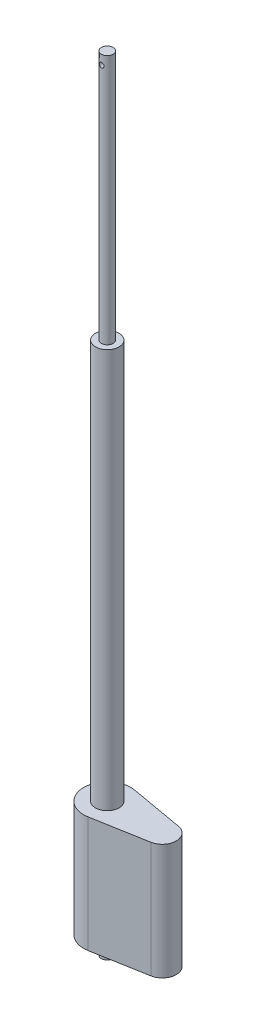
ISO-10303-21;
HEADER;
FILE_DESCRIPTION(('STEP AP214'),'2;1');
FILE_NAME('part.step','',(''),(''),'','','');
FILE_SCHEMA(('AUTOMOTIVE_DESIGN { 1 0 10303 214 1 1 1 1 }'));
ENDSEC;
DATA;
#1=APPLICATION_CONTEXT('core data for automotive mechanical design processes');
#2=APPLICATION_PROTOCOL_DEFINITION('international standard','automotive_design',2000,#1);
#3=PRODUCT_CONTEXT('',#1,'mechanical');
#4=PRODUCT('Part','Part','',(#3));
#5=PRODUCT_RELATED_PRODUCT_CATEGORY('part','',(#4));
#6=PRODUCT_DEFINITION_FORMATION('','',#4);
#7=PRODUCT_DEFINITION_CONTEXT('part definition',#1,'design');
#8=PRODUCT_DEFINITION('design','',#6,#7);
#9=PRODUCT_DEFINITION_SHAPE('','',#8);
#10=(LENGTH_UNIT() NAMED_UNIT(*) SI_UNIT(.MILLI.,.METRE.));
#11=(NAMED_UNIT(*) PLANE_ANGLE_UNIT() SI_UNIT($,.RADIAN.));
#12=(NAMED_UNIT(*) SI_UNIT($,.STERADIAN.) SOLID_ANGLE_UNIT());
#13=UNCERTAINTY_MEASURE_WITH_UNIT(LENGTH_MEASURE(1.E-05),#10,'distance_accuracy_value','');
#14=(GEOMETRIC_REPRESENTATION_CONTEXT(3) GLOBAL_UNCERTAINTY_ASSIGNED_CONTEXT((#13)) GLOBAL_UNIT_ASSIGNED_CONTEXT((#10,
#11,#12)) REPRESENTATION_CONTEXT('',''));
#15=CARTESIAN_POINT('',(0.,0.,0.));
#16=DIRECTION('',(0.,0.,1.));
#17=DIRECTION('',(1.,0.,0.));
#18=AXIS2_PLACEMENT_3D('',#15,#16,#17);
#19=CARTESIAN_POINT('',(0.,655.,0.));
#20=DIRECTION('',(0.,1.,0.));
#21=DIRECTION('',(0.,0.,1.));
#22=AXIS2_PLACEMENT_3D('',#19,#20,#21);
#23=CYLINDRICAL_SURFACE('',#22,4.99999999999993);
#24=CARTESIAN_POINT('',(0.,-2.,4.9999999999998));
#25=CARTESIAN_POINT('',(0.107493005442892,-1.99999014817627,4.99999271227065));
#26=CARTESIAN_POINT('',(0.215172564090674,-1.99128224791163,4.99649294306913));
#27=CARTESIAN_POINT('',(0.427496480417897,-1.95675229647877,4.98283453100622));
#28=CARTESIAN_POINT('',(0.532131777561248,-1.93088372091387,4.97265778698858));
#29=CARTESIAN_POINT('',(0.734953922727402,-1.86312392194117,4.94674209213099));
#30=CARTESIAN_POINT('',(0.833160661616957,-1.82128515378328,4.93102136364053));
#31=CARTESIAN_POINT('',(1.02107197032837,-1.72298082667346,4.89556610796058));
#32=CARTESIAN_POINT('',(1.11077947675099,-1.66652034508108,4.87583297458037));
#33=CARTESIAN_POINT('',(1.28350100757039,-1.53776450143907,4.83330886170399));
#34=CARTESIAN_POINT('',(1.36606227255021,-1.46489334375974,4.81042296929171));
#35=CARTESIAN_POINT('',(1.51817500478472,-1.30659999652323,4.76460576906175));
#36=CARTESIAN_POINT('',(1.58772010713353,-1.22117170278827,4.74167444453773));
#37=CARTESIAN_POINT('',(1.71487456729288,-1.03557192975774,4.69722791797117));
#38=CARTESIAN_POINT('',(1.77181498119547,-0.934913513976811,4.67582115964932));
#39=CARTESIAN_POINT('',(1.86775471903715,-0.724463601579966,4.63833647186773));
#40=CARTESIAN_POINT('',(1.90676256428583,-0.614676472151648,4.62225601244156));
#41=CARTESIAN_POINT('',(1.96389882339587,-0.394287666407906,4.59826357660799));
#42=CARTESIAN_POINT('',(1.98289396580565,-0.283948764423795,4.59001420355585));
#43=CARTESIAN_POINT('',(2.00217296164003,-0.0613650016927409,4.58164004049124));
#44=CARTESIAN_POINT('',(2.00246601631322,0.0508788946250062,4.58151125522748));
#45=CARTESIAN_POINT('',(1.98498936750454,0.265756671458035,4.58910500279974));
#46=CARTESIAN_POINT('',(1.96847531430514,0.368515714409022,4.5962817503843));
#47=CARTESIAN_POINT('',(1.91994688029782,0.569659556006704,4.61676187607816));
#48=CARTESIAN_POINT('',(1.88792979480463,0.668043588110298,4.63006632321653));
#49=CARTESIAN_POINT('',(1.80869473255107,0.860017836196032,4.6615948508851));
#50=CARTESIAN_POINT('',(1.76117986231532,0.953469239054681,4.67991379280768));
#51=CARTESIAN_POINT('',(1.65250646073222,1.13141581636155,4.7193811638987));
#52=CARTESIAN_POINT('',(1.59134280510085,1.2159076094028,4.74053065456829));
#53=CARTESIAN_POINT('',(1.45155059945444,1.38040972880199,4.78526736742251));
#54=CARTESIAN_POINT('',(1.37193746297064,1.45956872944601,4.80891664976132));
#55=CARTESIAN_POINT('',(1.2003144274302,1.60368447800203,4.85459824958262));
#56=CARTESIAN_POINT('',(1.10830206533444,1.66863839741028,4.87663024445305));
#57=CARTESIAN_POINT('',(0.912077652605848,1.78361744741582,4.91714681264529));
#58=CARTESIAN_POINT('',(0.807660491346482,1.83332228119704,4.93555270095395));
#59=CARTESIAN_POINT('',(0.591023765482887,1.91416786107805,4.96614828328739));
#60=CARTESIAN_POINT('',(0.478808196849679,1.9453180375574,4.97834113462363));
#61=CARTESIAN_POINT('',(0.256895887607825,1.9864482954197,4.99456139506891));
#62=CARTESIAN_POINT('',(0.14744329398554,1.99757245425355,4.99902945833495));
#63=CARTESIAN_POINT('',(-0.0718453098078116,2.00171310052861,5.00068478510612));
#64=CARTESIAN_POINT('',(-0.181681213223918,1.9947342815475,4.99787393582272));
#65=CARTESIAN_POINT('',(-0.393432739121982,1.963708247448,4.98557567063734));
#66=CARTESIAN_POINT('',(-0.495482491775469,1.94044201964902,4.97639391345504));
#67=CARTESIAN_POINT('',(-0.694135428060775,1.87856429169018,4.95259441405481));
#68=CARTESIAN_POINT('',(-0.790737910224839,1.83995082033132,4.93797597356511));
#69=CARTESIAN_POINT('',(-0.979078785816696,1.74721506032005,4.90416594770792));
#70=CARTESIAN_POINT('',(-1.0705780227554,1.69265452795685,4.88484815979784));
#71=CARTESIAN_POINT('',(-1.24344359124655,1.57005967609435,4.84373364745505));
#72=CARTESIAN_POINT('',(-1.32480584076112,1.50201995707738,4.82193593110251));
#73=CARTESIAN_POINT('',(-1.48072304302881,1.34912998705037,4.77645117638092));
#74=CARTESIAN_POINT('',(-1.55447393380606,1.26346645849379,4.75273441425032));
#75=CARTESIAN_POINT('',(-1.68675119741371,1.08055991699063,4.70741672917113));
#76=CARTESIAN_POINT('',(-1.7452750613375,0.983314999660052,4.68581615526491));
#77=CARTESIAN_POINT('',(-1.84580750193162,0.778538305405896,4.64714299907689));
#78=CARTESIAN_POINT('',(-1.88765059453445,0.670916000787691,4.63011630884768));
#79=CARTESIAN_POINT('',(-1.9522962197053,0.449266348284846,4.60323673477912));
#80=CARTESIAN_POINT('',(-1.97511280526931,0.335243794187576,4.59337855695978));
#81=CARTESIAN_POINT('',(-1.9997156172784,0.112872098225458,4.58271759299906));
#82=CARTESIAN_POINT('',(-2.00289708230287,0.00470516040665014,4.58131421008151));
#83=CARTESIAN_POINT('',(-1.99180315927753,-0.210544857713292,4.58614836033078));
#84=CARTESIAN_POINT('',(-1.97752998791378,-0.317628073902583,4.59238492324773));
#85=CARTESIAN_POINT('',(-1.93307136615365,-0.523332189855041,4.61126649079001));
#86=CARTESIAN_POINT('',(-1.90353749357098,-0.622120274432998,4.62364831827429));
#87=CARTESIAN_POINT('',(-1.83000544849102,-0.813378629613481,4.65324001232676));
#88=CARTESIAN_POINT('',(-1.78600328139382,-0.905847146899825,4.67045121205987));
#89=CARTESIAN_POINT('',(-1.68187276275974,-1.08760961927078,4.70898609604471));
#90=CARTESIAN_POINT('',(-1.62096533515949,-1.17641867013048,4.73048882313222));
#91=CARTESIAN_POINT('',(-1.4858921192715,-1.34299331720375,4.77463804372217));
#92=CARTESIAN_POINT('',(-1.41172233481813,-1.42075557212831,4.79728488048386));
#93=CARTESIAN_POINT('',(-1.24650550627247,-1.56820285326361,4.84293567087374));
#94=CARTESIAN_POINT('',(-1.15467600114615,-1.63703730689807,4.86586757962165));
#95=CARTESIAN_POINT('',(-0.95990032028579,-1.75833704262164,4.90800406713697));
#96=CARTESIAN_POINT('',(-0.856949004547248,-1.81079471215253,4.92720691092887));
#97=CARTESIAN_POINT('',(-0.644738062495213,-1.89662221519029,4.95939714815842));
#98=CARTESIAN_POINT('',(-0.535631618219705,-1.93032932356034,4.97249363055008));
#99=CARTESIAN_POINT('',(-0.31287654628123,-1.97863912095427,4.99144306209346));
#100=CARTESIAN_POINT('',(-0.199243525858922,-1.99330243674391,4.99731899495618));
#101=CARTESIAN_POINT('',(-0.0569122978909365,-1.99939538097828,4.99975899504117));
#102=CARTESIAN_POINT('',(-0.0284626887407618,-2.0000026086292,5.00000192969156));
#103=CARTESIAN_POINT('',(0.,-2.,4.9999999999998));
#104=B_SPLINE_CURVE_WITH_KNOTS('',3,(#24,#25,#26,#27,#28,#29,#30,#31,#32,#33,#34,#35,#36,#37,
#38,#39,#40,#41,#42,#43,#44,#45,#46,#47,#48,#49,#50,#51,#52,#53,#54,#55,#56,#57,#58,#59,#60,#61,
#62,#63,#64,#65,#66,#67,#68,#69,#70,#71,#72,#73,#74,#75,#76,#77,#78,#79,#80,#81,#82,#83,#84,#85,
#86,#87,#88,#89,#90,#91,#92,#93,#94,#95,#96,#97,#98,#99,#100,#101,#102,#103),.UNSPECIFIED.,.T.,
.F.,(4,2,2,2,2,2,2,2,2,2,2,2,2,2,2,2,2,2,2,2,2,2,2,2,2,2,2,2,2,2,2,2,2,2,2,2,2,2,2,4),(0.,
0.322402987893072,0.645683636007933,0.967911457471579,1.29002753567984,1.62597381700397,
1.96208394934411,2.31315258819217,2.66405423118268,2.99904105308828,3.33386306340488,
3.64538328401372,3.95695787256047,4.27489126298816,4.59294421938183,4.93558349186556,
5.27829092839732,5.62776913162806,5.9770695611379,6.30569184528007,6.63422893570082,
6.94800455564365,7.26182048993796,7.58523513398262,7.90877959498968,8.25368474624413,
8.59864669043748,8.94695045140827,9.29499672645933,9.61799673392748,9.94095572563045,
10.2511431854877,10.5614163580516,10.8894546805669,11.2175920134839,11.5670042353384,
11.9165786364053,12.2596430101332,12.6016125240434,12.686980458968),.UNSPECIFIED.);
#105=CARTESIAN_POINT('',(0.,-2.,4.9999999999998));
#106=VERTEX_POINT('',#105);
#107=EDGE_CURVE('E37',#106,#106,#104,.T.);
#108=ORIENTED_EDGE('',*,*,#107,.F.);
#109=EDGE_LOOP('',(#108));
#110=FACE_BOUND('',#109,.T.);
#111=CARTESIAN_POINT('',(2.,0.,-4.5825756949559));
#112=CARTESIAN_POINT('',(1.99999540068022,-0.107123689712964,-4.58258022779742));
#113=CARTESIAN_POINT('',(1.99134173553407,-0.21442629433185,-4.58638433797128));
#114=CARTESIAN_POINT('',(1.95706710874823,-0.42593908409958,-4.60111083306606));
#115=CARTESIAN_POINT('',(1.93140279032341,-0.530140654338524,-4.61205140628352));
#116=CARTESIAN_POINT('',(1.86423554476216,-0.732051808970831,-4.63960410719228));
#117=CARTESIAN_POINT('',(1.82279228998551,-0.829784243291226,-4.65619484260888));
#118=CARTESIAN_POINT('',(1.72542013194152,-1.0168853548623,-4.69314677188879));
#119=CARTESIAN_POINT('',(1.66949439157707,-1.10625585252411,-4.71350714220617));
#120=CARTESIAN_POINT('',(1.54132201423254,-1.27926031454434,-4.75700861562341));
#121=CARTESIAN_POINT('',(1.46837936836551,-1.36235639939725,-4.78023917022612));
#122=CARTESIAN_POINT('',(1.30970909513216,-1.51552902085581,-4.82612457915283));
#123=CARTESIAN_POINT('',(1.22397701877347,-1.58560100770971,-4.84877922991767));
#124=CARTESIAN_POINT('',(1.03800631337303,-1.71340639030972,-4.89203407641401));
#125=CARTESIAN_POINT('',(0.937328966419095,-1.77054429968594,-4.91251803612576));
#126=CARTESIAN_POINT('',(0.72682532206864,-1.86684357017379,-4.94803927702522));
#127=CARTESIAN_POINT('',(0.617002769076885,-1.90601224624887,-4.96307877403255));
#128=CARTESIAN_POINT('',(0.396966427039755,-1.96334148599309,-4.98538324990615));
#129=CARTESIAN_POINT('',(0.287028984858318,-1.98242731397023,-4.99298936770634));
#130=CARTESIAN_POINT('',(0.065266328583964,-2.00202848578146,-5.00080310687437));
#131=CARTESIAN_POINT('',(-0.0465581658394091,-2.0025507559658,-5.00101348770563));
#132=CARTESIAN_POINT('',(-0.262232494702087,-1.98551723019581,-4.99421962820619));
#133=CARTESIAN_POINT('',(-0.366177452870455,-1.96897522724529,-4.98761996771492));
#134=CARTESIAN_POINT('',(-0.569673109221911,-1.92000712369704,-4.96849291469147));
#135=CARTESIAN_POINT('',(-0.669223484391236,-1.88757985760154,-4.95596508721348));
#136=CARTESIAN_POINT('',(-0.862897938510555,-1.80736351712175,-4.92596824457473));
#137=CARTESIAN_POINT('',(-0.956917623378892,-1.75935028518462,-4.9084276046623));
#138=CARTESIAN_POINT('',(-1.13580815074131,-1.64953499308085,-4.87014585180281));
#139=CARTESIAN_POINT('',(-1.22067584271796,-1.58772820689984,-4.84940364267155));
#140=CARTESIAN_POINT('',(-1.38476882799017,-1.44735086405613,-4.80521637176129));
#141=CARTESIAN_POINT('',(-1.46325784526632,-1.36794610742721,-4.78168326511765));
#142=CARTESIAN_POINT('',(-1.60610741539265,-1.19700942816801,-4.73561660973269));
#143=CARTESIAN_POINT('',(-1.67046334378698,-1.10547355180441,-4.71308339008082));
#144=CARTESIAN_POINT('',(-1.78490418871927,-0.909580977626073,-4.67096897409029));
#145=CARTESIAN_POINT('',(-1.83453465163626,-0.80493516966136,-4.65148914057714));
#146=CARTESIAN_POINT('',(-1.91517625986646,-0.58778450968779,-4.6188759034409));
#147=CARTESIAN_POINT('',(-1.94619949837798,-0.475284815273422,-4.60573837891317));
#148=CARTESIAN_POINT('',(-1.9869549488549,-0.252964222532575,-4.58829759702722));
#149=CARTESIAN_POINT('',(-1.99787209681454,-0.143399552871453,-4.58350366456143));
#150=CARTESIAN_POINT('',(-2.00156132644289,0.0760772077595475,-4.58189497869044));
#151=CARTESIAN_POINT('',(-1.99433891059128,0.185989183275643,-4.58507780560368));
#152=CARTESIAN_POINT('',(-1.96303289479003,0.396458934956932,-4.59856044359119));
#153=CARTESIAN_POINT('',(-1.93993306202386,0.49719293740005,-4.60844457798307));
#154=CARTESIAN_POINT('',(-1.87880418691087,0.693288404785442,-4.63370051027345));
#155=CARTESIAN_POINT('',(-1.84077183430228,0.78864867310714,-4.64907352488604));
#156=CARTESIAN_POINT('',(-1.74913563948158,0.975602357795644,-4.68433781860107));
#157=CARTESIAN_POINT('',(-1.69496286826465,1.06688618869452,-4.70438704639183));
#158=CARTESIAN_POINT('',(-1.57316522444183,1.23948298744157,-4.74650385157801));
#159=CARTESIAN_POINT('',(-1.5055348734819,1.32079187279544,-4.76857224896051));
#160=CARTESIAN_POINT('',(-1.35284421168058,1.47737340859936,-4.81420915971422));
#161=CARTESIAN_POINT('',(-1.26686542944544,1.55175656529159,-4.83776807285239));
#162=CARTESIAN_POINT('',(-1.08308363336851,1.68517707660976,-4.88219794567538));
#163=CARTESIAN_POINT('',(-0.985280138466615,1.74421380659511,-4.90306879593141));
#164=CARTESIAN_POINT('',(-0.780279934003022,1.84504762646333,-4.93983715900396));
#165=CARTESIAN_POINT('',(-0.673085480998751,1.88684884417366,-4.95573586240666));
#166=CARTESIAN_POINT('',(-0.452393590914554,1.95154885239975,-4.9807271346891));
#167=CARTESIAN_POINT('',(-0.338899610276826,1.97445790141068,-4.98982339706109));
#168=CARTESIAN_POINT('',(-0.116816510362622,1.99950470165284,-4.99979008211865));
#169=CARTESIAN_POINT('',(-0.00839049265209416,2.00290012856202,-5.00115846749751));
#170=CARTESIAN_POINT('',(0.207433835792258,1.99214452061653,-4.99686042373727));
#171=CARTESIAN_POINT('',(0.31483229961438,1.97799614184441,-4.99119505948781));
#172=CARTESIAN_POINT('',(0.52217090173339,1.93345321200011,-4.97371513381842));
#173=CARTESIAN_POINT('',(0.622238803864861,1.90357105524344,-4.96209480699004));
#174=CARTESIAN_POINT('',(0.815922355542596,1.82894719411893,-4.93394947767364));
#175=CARTESIAN_POINT('',(0.909536811189114,1.7842027490609,-4.91742357062865));
#176=CARTESIAN_POINT('',(1.09220303880515,1.67889680664676,-4.88018094611873));
#177=CARTESIAN_POINT('',(1.18087037518738,1.61772372467486,-4.85931130687206));
#178=CARTESIAN_POINT('',(1.34705404014793,1.48221146125301,-4.81589402227086));
#179=CARTESIAN_POINT('',(1.42456572919734,1.40786683039179,-4.79334568464259));
#180=CARTESIAN_POINT('',(1.57120121894449,1.24268485315134,-4.74737767367686));
#181=CARTESIAN_POINT('',(1.63950871002775,1.1511114248559,-4.72399047228102));
#182=CARTESIAN_POINT('',(1.75984762763149,0.957057564279174,-4.68049656850755));
#183=CARTESIAN_POINT('',(1.81187714055767,0.854575851546457,-4.66039025195454));
#184=CARTESIAN_POINT('',(1.89399048451634,0.650963813529805,-4.62758914239069));
#185=CARTESIAN_POINT('',(1.92562535665267,0.550538397287561,-4.61439096680421));
#186=CARTESIAN_POINT('',(1.97271990928489,0.345510958507361,-4.59445826034126));
#187=CARTESIAN_POINT('',(1.98822466191608,0.240921426575648,-4.58770572290441));
#188=CARTESIAN_POINT('',(1.99692202185513,0.113221760888481,-4.58391763942096));
#189=CARTESIAN_POINT('',(1.99807530751895,0.0905985196435682,-4.5834153111729));
#190=CARTESIAN_POINT('',(1.9996148112425,0.0453195232027734,-4.58274384722728));
#191=CARTESIAN_POINT('',(2.0000009730612,0.0226637657448371,-4.58257473595926));
#192=CARTESIAN_POINT('',(2.,0.,-4.5825756949559));
#193=B_SPLINE_CURVE_WITH_KNOTS('',3,(#111,#112,#113,#114,#115,#116,#117,#118,#119,#120,#121,
#122,#123,#124,#125,#126,#127,#128,#129,#130,#131,#132,#133,#134,#135,#136,#137,#138,#139,#140,
#141,#142,#143,#144,#145,#146,#147,#148,#149,#150,#151,#152,#153,#154,#155,#156,#157,#158,#159,
#160,#161,#162,#163,#164,#165,#166,#167,#168,#169,#170,#171,#172,#173,#174,#175,#176,#177,#178,
#179,#180,#181,#182,#183,#184,#185,#186,#187,#188,#189,#190,#191,#192),.UNSPECIFIED.,.T.,.F.,(4,
2,2,2,2,2,2,2,2,2,2,2,2,2,2,2,2,2,2,2,2,2,2,2,2,2,2,2,2,2,2,2,2,2,2,2,2,2,2,2,4),(0.,
0.321277648767654,0.643377335822245,0.964270823293389,1.28509428823861,1.62255618284425,
1.96013574348342,2.31102669091428,2.6617746696948,2.99554182887183,3.32918445305672,
3.64408644830302,3.95901155129059,4.27868300234898,4.59846414940031,4.93924044081355,
5.28012807127126,5.63064458717257,5.98093304800101,6.3098214752442,6.63861014907939,
6.94867248085145,7.25880358651637,7.581511546527,7.90435114525849,8.25103734246979,
8.59773764852747,8.94435487312812,9.29078375954136,9.61461039755952,9.93838801512601,
10.2522199444335,10.5661097782858,10.8938705113992,11.221767165642,11.5699625328561,
11.9181988175919,12.2351666081908,12.5512463021924,12.619212852096,12.6871843847256),.UNSPECIFIED.);
#194=CARTESIAN_POINT('',(2.,0.,-4.5825756949559));
#195=VERTEX_POINT('',#194);
#196=EDGE_CURVE('E193',#195,#195,#193,.T.);
#197=ORIENTED_EDGE('',*,*,#196,.F.);
#198=EDGE_LOOP('',(#197));
#199=FACE_BOUND('',#198,.T.);
#200=CARTESIAN_POINT('',(0.,-8.00000000000001,-1.30104260698261E-13));
#201=DIRECTION('',(0.,1.,0.));
#202=DIRECTION('',(0.,0.,1.));
#203=AXIS2_PLACEMENT_3D('',#200,#201,#202);
#204=CIRCLE('',#203,4.99999999999994);
#205=CARTESIAN_POINT('',(0.,-8.00000000000001,4.99999999999981));
#206=VERTEX_POINT('',#205);
#207=EDGE_CURVE('E11',#206,#206,#204,.T.);
#208=ORIENTED_EDGE('',*,*,#207,.T.);
#209=EDGE_LOOP('',(#208));
#210=FACE_BOUND('',#209,.T.);
#211=CARTESIAN_POINT('',(0.,7.00000000000001,-1.26611265463828E-13));
#212=DIRECTION('',(0.,1.,0.));
#213=DIRECTION('',(0.,0.,1.));
#214=AXIS2_PLACEMENT_3D('',#211,#212,#213);
#215=CIRCLE('',#214,4.99999999999993);
#216=CARTESIAN_POINT('',(0.,7.00000000000001,4.99999999999981));
#217=VERTEX_POINT('',#216);
#218=EDGE_CURVE('E115',#217,#217,#215,.T.);
#219=ORIENTED_EDGE('',*,*,#218,.F.);
#220=EDGE_LOOP('',(#219));
#221=FACE_BOUND('',#220,.T.);
#222=ADVANCED_FACE('F33',(#110,#199,#210,#221),#23,.T.);
#223=CARTESIAN_POINT('',(0.,-8.,4.99999999999981));
#224=DIRECTION('',(0.,-1.,0.));
#225=DIRECTION('',(0.,0.,-1.));
#226=AXIS2_PLACEMENT_3D('',#223,#224,#225);
#227=PLANE('',#226);
#228=ORIENTED_EDGE('',*,*,#207,.F.);
#229=EDGE_LOOP('',(#228));
#230=FACE_BOUND('',#229,.T.);
#231=ADVANCED_FACE('F181',(#230),#227,.T.);
#232=CARTESIAN_POINT('',(0.,655.,5.));
#233=DIRECTION('',(0.,1.,0.));
#234=DIRECTION('',(0.,0.,1.));
#235=AXIS2_PLACEMENT_3D('',#232,#233,#234);
#236=PLANE('',#235);
#237=CARTESIAN_POINT('',(0.,655.,0.));
#238=DIRECTION('',(0.,1.,0.));
#239=DIRECTION('',(0.,0.,1.));
#240=AXIS2_PLACEMENT_3D('',#237,#238,#239);
#241=CIRCLE('',#240,4.99999999999997);
#242=CARTESIAN_POINT('',(0.,655.,5.));
#243=VERTEX_POINT('',#242);
#244=EDGE_CURVE('E46',#243,#243,#241,.T.);
#245=ORIENTED_EDGE('',*,*,#244,.T.);
#246=EDGE_LOOP('',(#245));
#247=FACE_BOUND('',#246,.T.);
#248=ADVANCED_FACE('F177',(#247),#236,.T.);
#249=CARTESIAN_POINT('',(0.,655.,0.));
#250=DIRECTION('',(0.,1.,0.));
#251=DIRECTION('',(0.,0.,1.));
#252=AXIS2_PLACEMENT_3D('',#249,#250,#251);
#253=CYLINDRICAL_SURFACE('',#252,5.);
#254=CARTESIAN_POINT('',(0.,645.,5.00000000000002));
#255=CARTESIAN_POINT('',(0.107493005442895,645.000009851824,4.99999271227087));
#256=CARTESIAN_POINT('',(0.215172564090675,645.008717752089,4.99649294306935));
#257=CARTESIAN_POINT('',(0.427496480417901,645.043247703521,4.98283453100643));
#258=CARTESIAN_POINT('',(0.532131777561258,645.069116279086,4.97265778698879));
#259=CARTESIAN_POINT('',(0.734953922727408,645.136876078059,4.94674209213121));
#260=CARTESIAN_POINT('',(0.833160661616954,645.178714846217,4.93102136364074));
#261=CARTESIAN_POINT('',(1.02107197032836,645.277019173327,4.8955661079608));
#262=CARTESIAN_POINT('',(1.11077947675099,645.333479654919,4.87583297458059));
#263=CARTESIAN_POINT('',(1.28350100757039,645.462235498561,4.83330886170421));
#264=CARTESIAN_POINT('',(1.36606227255022,645.53510665624,4.81042296929192));
#265=CARTESIAN_POINT('',(1.51817500478473,645.693400003477,4.76460576906196));
#266=CARTESIAN_POINT('',(1.58772010713353,645.778828297212,4.74167444453795));
#267=CARTESIAN_POINT('',(1.71487456729287,645.964428070242,4.69722791797139));
#268=CARTESIAN_POINT('',(1.77181498119546,646.065086486023,4.67582115964954));
#269=CARTESIAN_POINT('',(1.86775471903714,646.27553639842,4.63833647186795));
#270=CARTESIAN_POINT('',(1.90676256428583,646.385323527848,4.62225601244178));
#271=CARTESIAN_POINT('',(1.96389882339585,646.605712333592,4.59826357660821));
#272=CARTESIAN_POINT('',(1.98289396580562,646.716051235576,4.59001420355608));
#273=CARTESIAN_POINT('',(2.00217296164001,646.938634998307,4.58164004049147));
#274=CARTESIAN_POINT('',(2.00246601631321,647.050878894625,4.58151125522771));
#275=CARTESIAN_POINT('',(1.98498936750452,647.265756671458,4.58910500279997));
#276=CARTESIAN_POINT('',(1.96847531430511,647.368515714409,4.59628175038453));
#277=CARTESIAN_POINT('',(1.91994688029778,647.569659556007,4.6167618760784));
#278=CARTESIAN_POINT('',(1.88792979480458,647.66804358811,4.63006632321677));
#279=CARTESIAN_POINT('',(1.80869473255104,647.860017836196,4.66159485088534));
#280=CARTESIAN_POINT('',(1.7611798623153,647.953469239055,4.6799137928079));
#281=CARTESIAN_POINT('',(1.65250646073221,648.131415816362,4.71938116389892));
#282=CARTESIAN_POINT('',(1.59134280510082,648.215907609403,4.74053065456851));
#283=CARTESIAN_POINT('',(1.45155059945441,648.380409728802,4.78526736742274));
#284=CARTESIAN_POINT('',(1.37193746297062,648.459568729446,4.80891664976154));
#285=CARTESIAN_POINT('',(1.20031442743018,648.603684478002,4.85459824958285));
#286=CARTESIAN_POINT('',(1.10830206533441,648.66863839741,4.87663024445327));
#287=CARTESIAN_POINT('',(0.912077652605797,648.783617447416,4.91714681264551));
#288=CARTESIAN_POINT('',(0.807660491346428,648.833322281197,4.93555270095418));
#289=CARTESIAN_POINT('',(0.591023765482833,648.914167861078,4.96614828328762));
#290=CARTESIAN_POINT('',(0.478808196849627,648.945318037557,4.97834113462385));
#291=CARTESIAN_POINT('',(0.256895887607771,648.98644829542,4.99456139506913));
#292=CARTESIAN_POINT('',(0.147443293985482,648.997572454254,4.99902945833516));
#293=CARTESIAN_POINT('',(-0.0718453098078771,649.001713100529,5.00068478510633));
#294=CARTESIAN_POINT('',(-0.181681213223988,648.994734281548,4.99787393582293));
#295=CARTESIAN_POINT('',(-0.393432739122047,648.963708247448,4.98557567063755));
#296=CARTESIAN_POINT('',(-0.495482491775525,648.940442019649,4.97639391345525));
#297=CARTESIAN_POINT('',(-0.694135428060835,648.87856429169,4.95259441405501));
#298=CARTESIAN_POINT('',(-0.790737910224913,648.839950820331,4.93797597356531));
#299=CARTESIAN_POINT('',(-0.979078785816774,648.74721506032,4.90416594770812));
#300=CARTESIAN_POINT('',(-1.07057802275546,648.692654527957,4.88484815979804));
#301=CARTESIAN_POINT('',(-1.24344359124661,648.570059676094,4.84373364745525));
#302=CARTESIAN_POINT('',(-1.32480584076118,648.502019957077,4.82193593110271));
#303=CARTESIAN_POINT('',(-1.48072304302886,648.34912998705,4.77645117638113));
#304=CARTESIAN_POINT('',(-1.5544739338061,648.263466458494,4.75273441425053));
#305=CARTESIAN_POINT('',(-1.68675119741374,648.080559916991,4.70741672917133));
#306=CARTESIAN_POINT('',(-1.74527506133754,647.98331499966,4.68581615526512));
#307=CARTESIAN_POINT('',(-1.84580750193167,647.778538305406,4.64714299907709));
#308=CARTESIAN_POINT('',(-1.8876505945345,647.670916000788,4.63011630884788));
#309=CARTESIAN_POINT('',(-1.95229621970535,647.449266348285,4.60323673477932));
#310=CARTESIAN_POINT('',(-1.97511280526936,647.335243794187,4.59337855695998));
#311=CARTESIAN_POINT('',(-1.99971561727844,647.112872098225,4.58271759299927));
#312=CARTESIAN_POINT('',(-2.0028970823029,647.004705160407,4.58131421008172));
#313=CARTESIAN_POINT('',(-1.99180315927754,646.789455142287,4.58614836033099));
#314=CARTESIAN_POINT('',(-1.9775299879138,646.682371926097,4.59238492324795));
#315=CARTESIAN_POINT('',(-1.93307136615367,646.476667810145,4.61126649079022));
#316=CARTESIAN_POINT('',(-1.903537493571,646.377879725567,4.62364831827451));
#317=CARTESIAN_POINT('',(-1.83000544849102,646.186621370387,4.65324001232698));
#318=CARTESIAN_POINT('',(-1.78600328139382,646.0941528531,4.67045121206009));
#319=CARTESIAN_POINT('',(-1.68187276275973,645.912390380729,4.70898609604494));
#320=CARTESIAN_POINT('',(-1.62096533515948,645.82358132987,4.73048882313244));
#321=CARTESIAN_POINT('',(-1.48589211927147,645.657006682796,4.7746380437224));
#322=CARTESIAN_POINT('',(-1.41172233481809,645.579244427872,4.79728488048409));
#323=CARTESIAN_POINT('',(-1.24650550627242,645.431797146736,4.84293567087397));
#324=CARTESIAN_POINT('',(-1.1546760011461,645.362962693102,4.86586757962188));
#325=CARTESIAN_POINT('',(-0.959900320285739,645.241662957378,4.9080040671372));
#326=CARTESIAN_POINT('',(-0.8569490045472,645.189205287847,4.92720691092909));
#327=CARTESIAN_POINT('',(-0.64473806249517,645.10337778481,4.95939714815864));
#328=CARTESIAN_POINT('',(-0.53563161821966,645.06967067644,4.9724936305503));
#329=CARTESIAN_POINT('',(-0.312876546281177,645.021360879046,4.99144306209368));
#330=CARTESIAN_POINT('',(-0.199243525858864,645.006697563256,4.9973189949564));
#331=CARTESIAN_POINT('',(-0.0569122978908965,645.000604619022,4.99975899504139));
#332=CARTESIAN_POINT('',(-0.0284626887407416,644.999997391371,5.00000192969178));
#333=CARTESIAN_POINT('',(0.,645.,5.00000000000002));
#334=B_SPLINE_CURVE_WITH_KNOTS('',3,(#254,#255,#256,#257,#258,#259,#260,#261,#262,#263,#264,
#265,#266,#267,#268,#269,#270,#271,#272,#273,#274,#275,#276,#277,#278,#279,#280,#281,#282,#283,
#284,#285,#286,#287,#288,#289,#290,#291,#292,#293,#294,#295,#296,#297,#298,#299,#300,#301,#302,
#303,#304,#305,#306,#307,#308,#309,#310,#311,#312,#313,#314,#315,#316,#317,#318,#319,#320,#321,
#322,#323,#324,#325,#326,#327,#328,#329,#330,#331,#332,#333),.UNSPECIFIED.,.T.,.F.,(4,2,2,2,2,2,
2,2,2,2,2,2,2,2,2,2,2,2,2,2,2,2,2,2,2,2,2,2,2,2,2,2,2,2,2,2,2,2,2,4),(0.,0.322402987893083,
0.645683636007933,0.967911457471566,1.29002753567984,1.62597381700394,1.96208394934414,
2.31315258819217,2.66405423118265,2.99904105308821,3.33386306340493,3.64538328401382,
3.95695787256051,4.27489126298809,4.59294421938178,4.93558349186553,5.27829092839734,
5.62776913162804,5.97706956113791,6.30569184528009,6.63422893570084,6.94800455564368,
7.26182048993798,7.58523513398265,7.90877959498971,8.25368474624412,8.59864669043748,
8.9469504514084,9.29499672645944,9.61799673392757,9.94095572563052,10.2511431854878,
10.5614163580516,10.889454680567,11.2175920134841,11.5670042353385,11.9165786364054,
12.2596430101333,12.6016125240435,12.686980458968),.UNSPECIFIED.);
#335=CARTESIAN_POINT('',(0.,645.,5.00000000000002));
#336=VERTEX_POINT('',#335);
#337=EDGE_CURVE('E141',#336,#336,#334,.T.);
#338=ORIENTED_EDGE('',*,*,#337,.F.);
#339=EDGE_LOOP('',(#338));
#340=FACE_BOUND('',#339,.T.);
#341=CARTESIAN_POINT('',(1.99999999999998,647.,-4.58257569495583));
#342=CARTESIAN_POINT('',(1.9999954006802,646.892876310287,-4.58258022779736));
#343=CARTESIAN_POINT('',(1.99134173553404,646.785573705668,-4.58638433797121));
#344=CARTESIAN_POINT('',(1.9570671087482,646.5740609159,-4.60111083306599));
#345=CARTESIAN_POINT('',(1.93140279032339,646.469859345661,-4.61205140628345));
#346=CARTESIAN_POINT('',(1.86423554476216,646.267948191029,-4.6396041071922));
#347=CARTESIAN_POINT('',(1.82279228998553,646.170215756709,-4.65619484260879));
#348=CARTESIAN_POINT('',(1.72542013194155,645.983114645138,-4.6931467718887));
#349=CARTESIAN_POINT('',(1.6694943915771,645.893744147476,-4.71350714220608));
#350=CARTESIAN_POINT('',(1.54132201423258,645.720739685456,-4.75700861562332));
#351=CARTESIAN_POINT('',(1.46837936836556,645.637643600603,-4.78023917022602));
#352=CARTESIAN_POINT('',(1.3097090951322,645.484470979144,-4.82612457915274));
#353=CARTESIAN_POINT('',(1.22397701877351,645.41439899229,-4.84877922991758));
#354=CARTESIAN_POINT('',(1.03800631337304,645.28659360969,-4.89203407641392));
#355=CARTESIAN_POINT('',(0.9373289664191,645.229455700314,-4.91251803612568));
#356=CARTESIAN_POINT('',(0.726825322068651,645.133156429826,-4.94803927702513));
#357=CARTESIAN_POINT('',(0.617002769076908,645.093987753751,-4.96307877403247));
#358=CARTESIAN_POINT('',(0.396966427039782,645.036658514007,-4.98538324990606));
#359=CARTESIAN_POINT('',(0.287028984858336,645.01757268603,-4.99298936770625));
#360=CARTESIAN_POINT('',(0.0652663285839654,644.997971514219,-5.00080310687428));
#361=CARTESIAN_POINT('',(-0.0465581658394152,644.997449244034,-5.00101348770554));
#362=CARTESIAN_POINT('',(-0.262232494702105,645.014482769804,-4.9942196282061));
#363=CARTESIAN_POINT('',(-0.366177452870478,645.031024772755,-4.98761996771483));
#364=CARTESIAN_POINT('',(-0.569673109221924,645.079992876303,-4.96849291469139));
#365=CARTESIAN_POINT('',(-0.669223484391235,645.112420142398,-4.9559650872134));
#366=CARTESIAN_POINT('',(-0.862897938510551,645.192636482878,-4.92596824457465));
#367=CARTESIAN_POINT('',(-0.956917623378902,645.240649714815,-4.90842760466221));
#368=CARTESIAN_POINT('',(-1.13580815074132,645.350465006919,-4.87014585180272));
#369=CARTESIAN_POINT('',(-1.22067584271796,645.4122717931,-4.84940364267147));
#370=CARTESIAN_POINT('',(-1.3847688279902,645.552649135944,-4.8052163717612));
#371=CARTESIAN_POINT('',(-1.46325784526636,645.632053892573,-4.78168326511755));
#372=CARTESIAN_POINT('',(-1.60610741539269,645.802990571832,-4.73561660973259));
#373=CARTESIAN_POINT('',(-1.67046334378702,645.894526448196,-4.71308339008073));
#374=CARTESIAN_POINT('',(-1.78490418871928,646.090419022374,-4.67096897409021));
#375=CARTESIAN_POINT('',(-1.83453465163624,646.195064830339,-4.65148914057706));
#376=CARTESIAN_POINT('',(-1.91517625986644,646.412215490312,-4.61887590344083));
#377=CARTESIAN_POINT('',(-1.94619949837798,646.524715184727,-4.60573837891309));
#378=CARTESIAN_POINT('',(-1.98695494885491,646.747035777467,-4.58829759702713));
#379=CARTESIAN_POINT('',(-1.99787209681456,646.856600447128,-4.58350366456135));
#380=CARTESIAN_POINT('',(-2.00156132644292,647.076077207759,-4.58189497869034));
#381=CARTESIAN_POINT('',(-1.99433891059133,647.185989183276,-4.58507780560358));
#382=CARTESIAN_POINT('',(-1.96303289479007,647.396458934957,-4.59856044359109));
#383=CARTESIAN_POINT('',(-1.9399330620239,647.4971929374,-4.60844457798298));
#384=CARTESIAN_POINT('',(-1.87880418691092,647.693288404785,-4.63370051027336));
#385=CARTESIAN_POINT('',(-1.84077183430234,647.788648673107,-4.64907352488593));
#386=CARTESIAN_POINT('',(-1.74913563948164,647.975602357796,-4.68433781860096));
#387=CARTESIAN_POINT('',(-1.69496286826471,648.066886188694,-4.70438704639173));
#388=CARTESIAN_POINT('',(-1.57316522444188,648.239482987442,-4.74650385157791));
#389=CARTESIAN_POINT('',(-1.50553487348194,648.320791872795,-4.76857224896041));
#390=CARTESIAN_POINT('',(-1.35284421168059,648.477373408599,-4.81420915971414));
#391=CARTESIAN_POINT('',(-1.26686542944542,648.551756565292,-4.83776807285231));
#392=CARTESIAN_POINT('',(-1.08308363336849,648.68517707661,-4.8821979456753));
#393=CARTESIAN_POINT('',(-0.985280138466629,648.744213806595,-4.90306879593133));
#394=CARTESIAN_POINT('',(-0.780279934003054,648.845047626463,-4.93983715900387));
#395=CARTESIAN_POINT('',(-0.67308548099877,648.886848844174,-4.95573586240657));
#396=CARTESIAN_POINT('',(-0.452393590914569,648.9515488524,-4.98072713468901));
#397=CARTESIAN_POINT('',(-0.33889961027685,648.974457901411,-4.98982339706101));
#398=CARTESIAN_POINT('',(-0.116816510362657,648.999504701653,-4.99979008211856));
#399=CARTESIAN_POINT('',(-0.00839049265213086,649.002900128562,-5.00115846749743));
#400=CARTESIAN_POINT('',(0.207433835792218,648.992144520617,-4.99686042373719));
#401=CARTESIAN_POINT('',(0.314832299614337,648.977996141845,-4.99119505948772));
#402=CARTESIAN_POINT('',(0.522170901733333,648.933453212,-4.97371513381834));
#403=CARTESIAN_POINT('',(0.622238803864791,648.903571055243,-4.96209480698996));
#404=CARTESIAN_POINT('',(0.815922355542535,648.828947194119,-4.93394947767357));
#405=CARTESIAN_POINT('',(0.909536811189075,648.784202749061,-4.91742357062858));
#406=CARTESIAN_POINT('',(1.09220303880511,648.678896806647,-4.88018094611866));
#407=CARTESIAN_POINT('',(1.18087037518731,648.617723724675,-4.859311306872));
#408=CARTESIAN_POINT('',(1.34705404014786,648.482211461253,-4.81589402227079));
#409=CARTESIAN_POINT('',(1.4245657291973,648.407866830392,-4.79334568464252));
#410=CARTESIAN_POINT('',(1.5712012189445,648.242684853151,-4.74737767367678));
#411=CARTESIAN_POINT('',(1.63950871002778,648.151111424856,-4.72399047228093));
#412=CARTESIAN_POINT('',(1.75984762763151,647.957057564279,-4.68049656850746));
#413=CARTESIAN_POINT('',(1.81187714055766,647.854575851546,-4.66039025195446));
#414=CARTESIAN_POINT('',(1.89399048451632,647.65096381353,-4.62758914239062));
#415=CARTESIAN_POINT('',(1.92562535665267,647.550538397287,-4.61439096680412));
#416=CARTESIAN_POINT('',(1.97271990928489,647.345510958507,-4.59445826034117));
#417=CARTESIAN_POINT('',(1.98822466191606,647.240921426576,-4.58770572290434));
#418=CARTESIAN_POINT('',(1.99692202185511,647.113221760888,-4.58391763942089));
#419=CARTESIAN_POINT('',(1.99807530751893,647.090598519644,-4.58341531117282));
#420=CARTESIAN_POINT('',(1.99961481124249,647.045319523203,-4.58274384722721));
#421=CARTESIAN_POINT('',(2.00000097306118,647.022663765745,-4.58257473595919));
#422=CARTESIAN_POINT('',(1.99999999999998,647.,-4.58257569495583));
#423=B_SPLINE_CURVE_WITH_KNOTS('',3,(#341,#342,#343,#344,#345,#346,#347,#348,#349,#350,#351,
#352,#353,#354,#355,#356,#357,#358,#359,#360,#361,#362,#363,#364,#365,#366,#367,#368,#369,#370,
#371,#372,#373,#374,#375,#376,#377,#378,#379,#380,#381,#382,#383,#384,#385,#386,#387,#388,#389,
#390,#391,#392,#393,#394,#395,#396,#397,#398,#399,#400,#401,#402,#403,#404,#405,#406,#407,#408,
#409,#410,#411,#412,#413,#414,#415,#416,#417,#418,#419,#420,#421,#422),.UNSPECIFIED.,.T.,.F.,(4,
2,2,2,2,2,2,2,2,2,2,2,2,2,2,2,2,2,2,2,2,2,2,2,2,2,2,2,2,2,2,2,2,2,2,2,2,2,2,2,4),(0.,
0.321277648767676,0.643377335822211,0.964270823293319,1.28509428823845,1.62255618284419,
1.96013574348342,2.31102669091422,2.66177466969475,2.99554182887181,3.32918445305672,
3.64408644830302,3.95901155129058,4.27868300234895,4.59846414940024,4.93924044081369,
5.28012807127124,5.63064458717244,5.98093304800092,6.30982147524403,6.63861014907934,
6.9486724808514,7.25880358651633,7.58151154652689,7.90435114525854,8.25103734246984,
8.5977376485275,8.94435487312814,9.29078375954137,9.61461039755953,9.938388015126,
10.2522199444335,10.5661097782858,10.8938705113992,11.221767165642,11.5699625328562,
11.918198817592,12.2351666081908,12.5512463021925,12.619212852096,12.6871843847256),.UNSPECIFIED.);
#424=CARTESIAN_POINT('',(1.99999999999998,647.,-4.58257569495583));
#425=VERTEX_POINT('',#424);
#426=EDGE_CURVE('E114',#425,#425,#423,.T.);
#427=ORIENTED_EDGE('',*,*,#426,.F.);
#428=EDGE_LOOP('',(#427));
#429=FACE_BOUND('',#428,.T.);
#430=CARTESIAN_POINT('',(0.,443.,0.));
#431=DIRECTION('',(0.,1.,0.));
#432=DIRECTION('',(0.,0.,1.));
#433=AXIS2_PLACEMENT_3D('',#430,#431,#432);
#434=CIRCLE('',#433,5.00000000000002);
#435=CARTESIAN_POINT('',(0.,443.,5.));
#436=VERTEX_POINT('',#435);
#437=EDGE_CURVE('E129',#436,#436,#434,.T.);
#438=ORIENTED_EDGE('',*,*,#437,.T.);
#439=EDGE_LOOP('',(#438));
#440=FACE_BOUND('',#439,.T.);
#441=ORIENTED_EDGE('',*,*,#244,.F.);
#442=EDGE_LOOP('',(#441));
#443=FACE_BOUND('',#442,.T.);
#444=ADVANCED_FACE('F145',(#340,#429,#440,#443),#253,.T.);
#445=CARTESIAN_POINT('',(0.,443.,10.));
#446=DIRECTION('',(0.,1.,0.));
#447=DIRECTION('',(0.,0.,1.));
#448=AXIS2_PLACEMENT_3D('',#445,#446,#447);
#449=PLANE('',#448);
#450=CARTESIAN_POINT('',(0.,443.,0.));
#451=DIRECTION('',(0.,1.,0.));
#452=DIRECTION('',(0.,0.,1.));
#453=AXIS2_PLACEMENT_3D('',#450,#451,#452);
#454=CIRCLE('',#453,10.);
#455=CARTESIAN_POINT('',(0.,443.,10.));
#456=VERTEX_POINT('',#455);
#457=EDGE_CURVE('E126',#456,#456,#454,.T.);
#458=ORIENTED_EDGE('',*,*,#457,.T.);
#459=EDGE_LOOP('',(#458));
#460=FACE_BOUND('',#459,.T.);
#461=ORIENTED_EDGE('',*,*,#437,.F.);
#462=EDGE_LOOP('',(#461));
#463=FACE_BOUND('',#462,.T.);
#464=ADVANCED_FACE('F170',(#460,#463),#449,.T.);
#465=CARTESIAN_POINT('',(0.,655.,0.));
#466=DIRECTION('',(0.,1.,0.));
#467=DIRECTION('',(0.,0.,1.));
#468=AXIS2_PLACEMENT_3D('',#465,#466,#467);
#469=CYLINDRICAL_SURFACE('',#468,10.);
#470=CARTESIAN_POINT('',(0.,105.,-1.03790363265532E-13));
#471=DIRECTION('',(0.,1.,0.));
#472=DIRECTION('',(0.,0.,1.));
#473=AXIS2_PLACEMENT_3D('',#470,#471,#472);
#474=CIRCLE('',#473,9.99999999999999);
#475=CARTESIAN_POINT('',(0.,105.,9.99999999999988));
#476=VERTEX_POINT('',#475);
#477=EDGE_CURVE('E123',#476,#476,#474,.T.);
#478=ORIENTED_EDGE('',*,*,#477,.T.);
#479=EDGE_LOOP('',(#478));
#480=FACE_BOUND('',#479,.T.);
#481=ORIENTED_EDGE('',*,*,#457,.F.);
#482=EDGE_LOOP('',(#481));
#483=FACE_BOUND('',#482,.T.);
#484=ADVANCED_FACE('F168',(#480,#483),#469,.T.);
#485=CARTESIAN_POINT('',(0.,105.,9.99999999999988));
#486=DIRECTION('',(0.,1.,0.));
#487=DIRECTION('',(0.,0.,1.));
#488=AXIS2_PLACEMENT_3D('',#485,#486,#487);
#489=PLANE('',#488);
#490=CARTESIAN_POINT('',(0.,105.,-1.03790363265532E-13));
#491=DIRECTION('',(0.,1.,0.));
#492=DIRECTION('',(0.,0.,1.));
#493=AXIS2_PLACEMENT_3D('',#490,#491,#492);
#494=CIRCLE('',#493,20.);
#495=CARTESIAN_POINT('',(3.49102718940243,105.,-19.6929614117039));
#496=VERTEX_POINT('',#495);
#497=CARTESIAN_POINT('',(3.49102718940235,105.,19.6929614117038));
#498=VERTEX_POINT('',#497);
#499=EDGE_CURVE('E121',#496,#498,#494,.T.);
#500=ORIENTED_EDGE('',*,*,#499,.T.);
#501=DIRECTION('',(0.984648070585188,0.,-0.174551359470116));
#502=VECTOR('',#501,1.);
#503=CARTESIAN_POINT('',(48.6292420888951,105.,11.6911818824166));
#504=LINE('',#503,#502);
#505=CARTESIAN_POINT('',(48.6292420888951,105.,11.6911818824166));
#506=VERTEX_POINT('',#505);
#507=EDGE_CURVE('E63',#498,#506,#504,.T.);
#508=ORIENTED_EDGE('',*,*,#507,.T.);
#509=CARTESIAN_POINT('',(46.5567130784281,105.,0.));
#510=DIRECTION('',(0.,1.,0.));
#511=DIRECTION('',(0.,0.,-1.));
#512=AXIS2_PLACEMENT_3D('',#509,#510,#511);
#513=CIRCLE('',#512,11.8734624397002);
#514=CARTESIAN_POINT('',(48.6292420888952,105.,-11.6911818824164));
#515=VERTEX_POINT('',#514);
#516=EDGE_CURVE('E90',#506,#515,#513,.T.);
#517=ORIENTED_EDGE('',*,*,#516,.T.);
#518=DIRECTION('',(-0.984648070585188,0.,-0.174551359470121));
#519=VECTOR('',#518,1.);
#520=CARTESIAN_POINT('',(3.49102718940243,105.,-19.6929614117039));
#521=LINE('',#520,#519);
#522=EDGE_CURVE('E98',#515,#496,#521,.T.);
#523=ORIENTED_EDGE('',*,*,#522,.T.);
#524=EDGE_LOOP('',(#500,#508,#517,#523));
#525=FACE_BOUND('',#524,.T.);
#526=ORIENTED_EDGE('',*,*,#477,.F.);
#527=EDGE_LOOP('',(#526));
#528=FACE_BOUND('',#527,.T.);
#529=ADVANCED_FACE('F96',(#525,#528),#489,.T.);
#530=CARTESIAN_POINT('',(0.,655.,0.));
#531=DIRECTION('',(0.,1.,0.));
#532=DIRECTION('',(0.,0.,1.));
#533=AXIS2_PLACEMENT_3D('',#530,#531,#532);
#534=CYLINDRICAL_SURFACE('',#533,20.);
#535=DIRECTION('',(0.,1.,0.));
#536=VECTOR('',#535,1.);
#537=CARTESIAN_POINT('',(3.49102718940235,-81.0414245216673,19.6929614117038));
#538=LINE('',#537,#536);
#539=CARTESIAN_POINT('',(3.49102718940235,7.,19.6929614117038));
#540=VERTEX_POINT('',#539);
#541=EDGE_CURVE('E110',#540,#498,#538,.T.);
#542=ORIENTED_EDGE('',*,*,#541,.T.);
#543=ORIENTED_EDGE('',*,*,#499,.F.);
#544=DIRECTION('',(0.,1.,0.));
#545=VECTOR('',#544,1.);
#546=CARTESIAN_POINT('',(3.49102718940243,-81.0414245216673,-19.6929614117039));
#547=LINE('',#546,#545);
#548=CARTESIAN_POINT('',(3.49102718940244,7.00000000000001,-19.6929614117039));
#549=VERTEX_POINT('',#548);
#550=EDGE_CURVE('E102',#549,#496,#547,.T.);
#551=ORIENTED_EDGE('',*,*,#550,.F.);
#552=CARTESIAN_POINT('',(0.,7.00000000000001,-1.26611265463828E-13));
#553=DIRECTION('',(0.,1.,0.));
#554=DIRECTION('',(0.,0.,1.));
#555=AXIS2_PLACEMENT_3D('',#552,#553,#554);
#556=CIRCLE('',#555,20.0000000000001);
#557=EDGE_CURVE('E118',#549,#540,#556,.T.);
#558=ORIENTED_EDGE('',*,*,#557,.T.);
#559=EDGE_LOOP('',(#542,#543,#551,#558));
#560=FACE_BOUND('',#559,.T.);
#561=ADVANCED_FACE('F161',(#560),#534,.T.);
#562=CARTESIAN_POINT('',(0.,7.,4.99999999999981));
#563=DIRECTION('',(0.,-1.,0.));
#564=DIRECTION('',(0.,0.,-1.));
#565=AXIS2_PLACEMENT_3D('',#562,#563,#564);
#566=PLANE('',#565);
#567=ORIENTED_EDGE('',*,*,#218,.T.);
#568=EDGE_LOOP('',(#567));
#569=FACE_BOUND('',#568,.T.);
#570=ORIENTED_EDGE('',*,*,#557,.F.);
#571=DIRECTION('',(-0.984648070585188,0.,-0.174551359470121));
#572=VECTOR('',#571,1.);
#573=CARTESIAN_POINT('',(3.49102718940243,7.00000000000001,-19.6929614117039));
#574=LINE('',#573,#572);
#575=CARTESIAN_POINT('',(48.6292420888952,7.00000000000001,-11.6911818824165));
#576=VERTEX_POINT('',#575);
#577=EDGE_CURVE('E54',#576,#549,#574,.T.);
#578=ORIENTED_EDGE('',*,*,#577,.F.);
#579=CARTESIAN_POINT('',(46.5567130784281,7.00000000000001,0.));
#580=DIRECTION('',(0.,-1.,0.));
#581=DIRECTION('',(0.,0.,-1.));
#582=AXIS2_PLACEMENT_3D('',#579,#580,#581);
#583=CIRCLE('',#582,11.8734624397002);
#584=CARTESIAN_POINT('',(48.6292420888951,7.00000000000001,11.6911818824165));
#585=VERTEX_POINT('',#584);
#586=EDGE_CURVE('E82',#585,#576,#583,.F.);
#587=ORIENTED_EDGE('',*,*,#586,.F.);
#588=DIRECTION('',(0.984648070585189,0.,-0.174551359470116));
#589=VECTOR('',#588,1.);
#590=CARTESIAN_POINT('',(48.6292420888951,7.00000000000001,11.6911818824166));
#591=LINE('',#590,#589);
#592=EDGE_CURVE('E79',#540,#585,#591,.T.);
#593=ORIENTED_EDGE('',*,*,#592,.F.);
#594=EDGE_LOOP('',(#570,#578,#587,#593));
#595=FACE_BOUND('',#594,.T.);
#596=ADVANCED_FACE('F154',(#569,#595),#566,.T.);
#597=CARTESIAN_POINT('',(0.,647.,-20.0000000000002));
#598=DIRECTION('',(0.,0.,1.));
#599=DIRECTION('',(1.,0.,0.));
#600=AXIS2_PLACEMENT_3D('',#597,#598,#599);
#601=CYLINDRICAL_SURFACE('',#600,2.00000000000001);
#602=ORIENTED_EDGE('',*,*,#337,.T.);
#603=EDGE_LOOP('',(#602));
#604=FACE_BOUND('',#603,.T.);
#605=ORIENTED_EDGE('',*,*,#426,.T.);
#606=EDGE_LOOP('',(#605));
#607=FACE_BOUND('',#606,.T.);
#608=ADVANCED_FACE('F149',(#604,#607),#601,.F.);
#609=CARTESIAN_POINT('',(0.,0.,-20.0000000000002));
#610=DIRECTION('',(0.,0.,1.));
#611=DIRECTION('',(1.,0.,0.));
#612=AXIS2_PLACEMENT_3D('',#609,#610,#611);
#613=CYLINDRICAL_SURFACE('',#612,2.);
#614=ORIENTED_EDGE('',*,*,#107,.T.);
#615=EDGE_LOOP('',(#614));
#616=FACE_BOUND('',#615,.T.);
#617=ORIENTED_EDGE('',*,*,#196,.T.);
#618=EDGE_LOOP('',(#617));
#619=FACE_BOUND('',#618,.T.);
#620=ADVANCED_FACE('F153',(#616,#619),#613,.F.);
#621=CARTESIAN_POINT('',(48.6292420888951,-81.0414245216673,11.6911818824166));
#622=DIRECTION('',(0.174551359470116,0.,0.984648070585188));
#623=DIRECTION('',(0.984648070585189,0.,-0.174551359470116));
#624=AXIS2_PLACEMENT_3D('',#621,#622,#623);
#625=PLANE('',#624);
#626=ORIENTED_EDGE('',*,*,#541,.F.);
#627=ORIENTED_EDGE('',*,*,#592,.T.);
#628=DIRECTION('',(0.,1.,0.));
#629=VECTOR('',#628,1.);
#630=CARTESIAN_POINT('',(48.6292420888951,-81.0414245216673,11.6911818824165));
#631=LINE('',#630,#629);
#632=EDGE_CURVE('E104',#585,#506,#631,.T.);
#633=ORIENTED_EDGE('',*,*,#632,.T.);
#634=ORIENTED_EDGE('',*,*,#507,.F.);
#635=EDGE_LOOP('',(#626,#627,#633,#634));
#636=FACE_BOUND('',#635,.T.);
#637=ADVANCED_FACE('F197',(#636),#625,.T.);
#638=CARTESIAN_POINT('',(46.5567130784281,-81.0414245216673,0.));
#639=DIRECTION('',(0.,1.,0.));
#640=DIRECTION('',(0.,0.,1.));
#641=AXIS2_PLACEMENT_3D('',#638,#639,#640);
#642=CYLINDRICAL_SURFACE('',#641,11.8734624397002);
#643=ORIENTED_EDGE('',*,*,#632,.F.);
#644=ORIENTED_EDGE('',*,*,#586,.T.);
#645=DIRECTION('',(0.,1.,0.));
#646=VECTOR('',#645,1.);
#647=CARTESIAN_POINT('',(48.6292420888952,-81.0414245216673,-11.6911818824165));
#648=LINE('',#647,#646);
#649=EDGE_CURVE('E87',#576,#515,#648,.T.);
#650=ORIENTED_EDGE('',*,*,#649,.T.);
#651=ORIENTED_EDGE('',*,*,#516,.F.);
#652=EDGE_LOOP('',(#643,#644,#650,#651));
#653=FACE_BOUND('',#652,.T.);
#654=ADVANCED_FACE('F89',(#653),#642,.T.);
#655=CARTESIAN_POINT('',(3.49102718940243,-81.0414245216673,-19.6929614117039));
#656=DIRECTION('',(0.174551359470121,0.,-0.984648070585188));
#657=DIRECTION('',(-0.984648070585188,0.,-0.174551359470121));
#658=AXIS2_PLACEMENT_3D('',#655,#656,#657);
#659=PLANE('',#658);
#660=ORIENTED_EDGE('',*,*,#649,.F.);
#661=ORIENTED_EDGE('',*,*,#577,.T.);
#662=ORIENTED_EDGE('',*,*,#550,.T.);
#663=ORIENTED_EDGE('',*,*,#522,.F.);
#664=EDGE_LOOP('',(#660,#661,#662,#663));
#665=FACE_BOUND('',#664,.T.);
#666=ADVANCED_FACE('F101',(#665),#659,.T.);
#667=CLOSED_SHELL('',(#222,#231,#248,#444,#464,#484,#529,#561,#596,#608,#620,#637,#654,#666));
#668=MANIFOLD_SOLID_BREP('B2',#667);
#669=ADVANCED_BREP_SHAPE_REPRESENTATION('',(#18,#668),#14);
#670=SHAPE_DEFINITION_REPRESENTATION(#9,#669);
ENDSEC;
END-ISO-10303-21;
